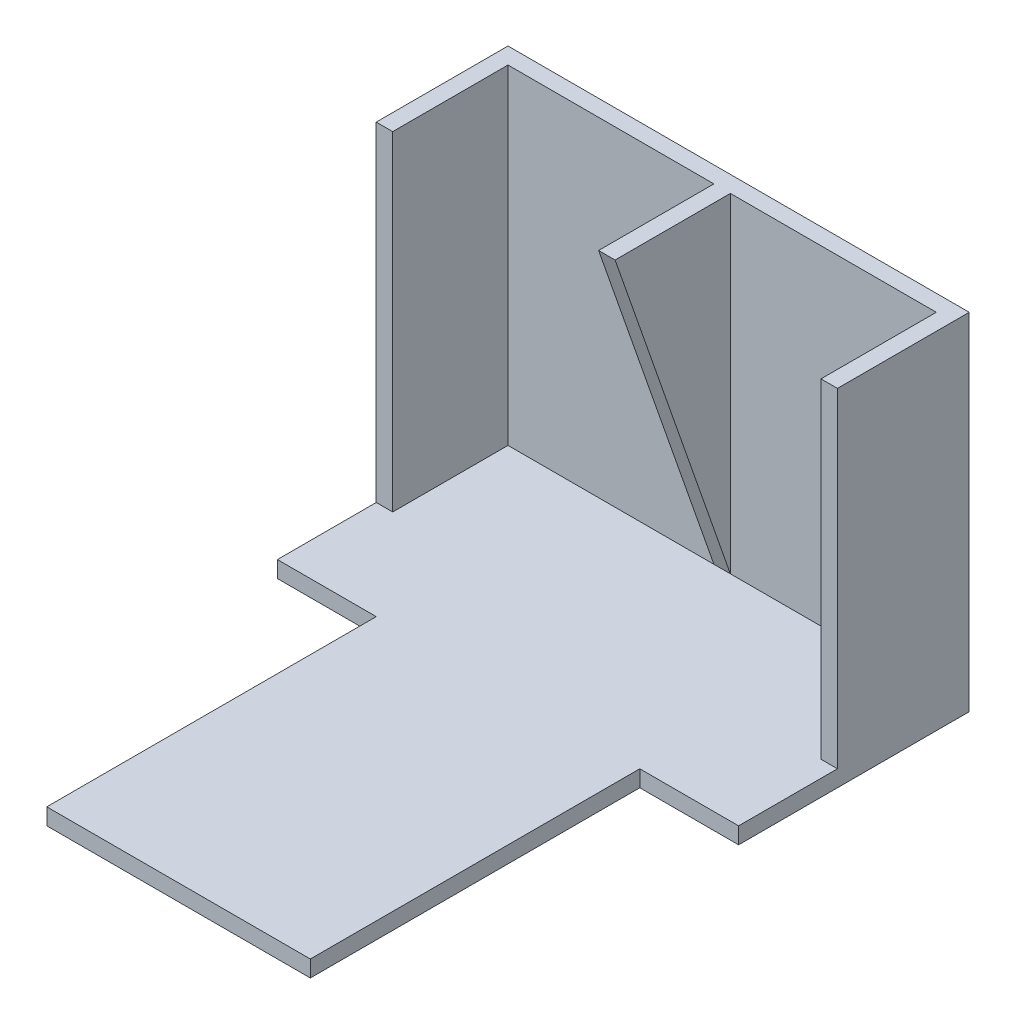
ISO-10303-21;
HEADER;
FILE_DESCRIPTION(('STEP AP214'),'2;1');
FILE_NAME('part.step','',(''),(''),'','','');
FILE_SCHEMA(('AUTOMOTIVE_DESIGN { 1 0 10303 214 1 1 1 1 }'));
ENDSEC;
DATA;
#1=APPLICATION_CONTEXT('core data for automotive mechanical design processes');
#2=APPLICATION_PROTOCOL_DEFINITION('international standard','automotive_design',2000,#1);
#3=PRODUCT_CONTEXT('',#1,'mechanical');
#4=PRODUCT('Part','Part','',(#3));
#5=PRODUCT_RELATED_PRODUCT_CATEGORY('part','',(#4));
#6=PRODUCT_DEFINITION_FORMATION('','',#4);
#7=PRODUCT_DEFINITION_CONTEXT('part definition',#1,'design');
#8=PRODUCT_DEFINITION('design','',#6,#7);
#9=PRODUCT_DEFINITION_SHAPE('','',#8);
#10=(LENGTH_UNIT() NAMED_UNIT(*) SI_UNIT(.MILLI.,.METRE.));
#11=(NAMED_UNIT(*) PLANE_ANGLE_UNIT() SI_UNIT($,.RADIAN.));
#12=(NAMED_UNIT(*) SI_UNIT($,.STERADIAN.) SOLID_ANGLE_UNIT());
#13=UNCERTAINTY_MEASURE_WITH_UNIT(LENGTH_MEASURE(1.E-05),#10,'distance_accuracy_value','');
#14=(GEOMETRIC_REPRESENTATION_CONTEXT(3) GLOBAL_UNCERTAINTY_ASSIGNED_CONTEXT((#13)) GLOBAL_UNIT_ASSIGNED_CONTEXT((#10,
#11,#12)) REPRESENTATION_CONTEXT('',''));
#15=CARTESIAN_POINT('',(0.,0.,0.));
#16=DIRECTION('',(0.,0.,1.));
#17=DIRECTION('',(1.,0.,0.));
#18=AXIS2_PLACEMENT_3D('',#15,#16,#17);
#19=CARTESIAN_POINT('',(0.,2.5,0.));
#20=DIRECTION('',(0.,-1.,0.));
#21=DIRECTION('',(0.,0.,-1.));
#22=AXIS2_PLACEMENT_3D('',#19,#20,#21);
#23=PLANE('',#22);
#24=DIRECTION('',(1.,0.,0.));
#25=VECTOR('',#24,1.);
#26=CARTESIAN_POINT('',(35.,2.5,2.5));
#27=LINE('',#26,#25);
#28=CARTESIAN_POINT('',(32.5,2.5,2.5));
#29=VERTEX_POINT('',#28);
#30=CARTESIAN_POINT('',(35.,2.5,2.5));
#31=VERTEX_POINT('',#30);
#32=EDGE_CURVE('E54',#29,#31,#27,.T.);
#33=ORIENTED_EDGE('',*,*,#32,.F.);
#34=DIRECTION('',(0.,0.,1.));
#35=VECTOR('',#34,1.);
#36=CARTESIAN_POINT('',(32.5,2.5,-15.));
#37=LINE('',#36,#35);
#38=CARTESIAN_POINT('',(32.5,2.5,-15.));
#39=VERTEX_POINT('',#38);
#40=EDGE_CURVE('E58',#39,#29,#37,.T.);
#41=ORIENTED_EDGE('',*,*,#40,.F.);
#42=DIRECTION('',(1.,0.,0.));
#43=VECTOR('',#42,1.);
#44=CARTESIAN_POINT('',(32.5,2.5,-15.));
#45=LINE('',#44,#43);
#46=CARTESIAN_POINT('',(1.24999999999998,2.5,-15.));
#47=VERTEX_POINT('',#46);
#48=EDGE_CURVE('E222',#47,#39,#45,.T.);
#49=ORIENTED_EDGE('',*,*,#48,.F.);
#50=DIRECTION('',(1.,0.,0.));
#51=VECTOR('',#50,1.);
#52=CARTESIAN_POINT('',(-35.0010000000001,2.5,-15.));
#53=LINE('',#52,#51);
#54=CARTESIAN_POINT('',(-1.25000000000001,2.5,-15.));
#55=VERTEX_POINT('',#54);
#56=EDGE_CURVE('E215',#55,#47,#53,.T.);
#57=ORIENTED_EDGE('',*,*,#56,.F.);
#58=DIRECTION('',(1.,0.,0.));
#59=VECTOR('',#58,1.);
#60=CARTESIAN_POINT('',(-1.25000000000001,2.5,-15.));
#61=LINE('',#60,#59);
#62=CARTESIAN_POINT('',(-32.5,2.5,-15.));
#63=VERTEX_POINT('',#62);
#64=EDGE_CURVE('E219',#63,#55,#61,.T.);
#65=ORIENTED_EDGE('',*,*,#64,.F.);
#66=DIRECTION('',(0.,0.,-1.));
#67=VECTOR('',#66,1.);
#68=CARTESIAN_POINT('',(-32.5,2.5,-15.));
#69=LINE('',#68,#67);
#70=CARTESIAN_POINT('',(-32.5,2.5,2.5));
#71=VERTEX_POINT('',#70);
#72=EDGE_CURVE('E214',#71,#63,#69,.T.);
#73=ORIENTED_EDGE('',*,*,#72,.F.);
#74=DIRECTION('',(1.,0.,0.));
#75=VECTOR('',#74,1.);
#76=CARTESIAN_POINT('',(-35.,2.5,2.5));
#77=LINE('',#76,#75);
#78=CARTESIAN_POINT('',(-35.,2.5,2.5));
#79=VERTEX_POINT('',#78);
#80=EDGE_CURVE('E210',#79,#71,#77,.T.);
#81=ORIENTED_EDGE('',*,*,#80,.F.);
#82=DIRECTION('',(0.,0.,1.));
#83=VECTOR('',#82,1.);
#84=CARTESIAN_POINT('',(-35.,2.5,17.5));
#85=LINE('',#84,#83);
#86=CARTESIAN_POINT('',(-35.,2.5,17.5));
#87=VERTEX_POINT('',#86);
#88=EDGE_CURVE('E263',#79,#87,#85,.T.);
#89=ORIENTED_EDGE('',*,*,#88,.T.);
#90=DIRECTION('',(1.,0.,0.));
#91=VECTOR('',#90,1.);
#92=CARTESIAN_POINT('',(-35.,2.5,17.5));
#93=LINE('',#92,#91);
#94=CARTESIAN_POINT('',(-20.,2.5,17.5));
#95=VERTEX_POINT('',#94);
#96=EDGE_CURVE('E267',#87,#95,#93,.T.);
#97=ORIENTED_EDGE('',*,*,#96,.T.);
#98=DIRECTION('',(0.,0.,1.));
#99=VECTOR('',#98,1.);
#100=CARTESIAN_POINT('',(-20.,2.5,17.5));
#101=LINE('',#100,#99);
#102=CARTESIAN_POINT('',(-20.,2.5,67.5));
#103=VERTEX_POINT('',#102);
#104=EDGE_CURVE('E270',#95,#103,#101,.T.);
#105=ORIENTED_EDGE('',*,*,#104,.T.);
#106=DIRECTION('',(1.,0.,0.));
#107=VECTOR('',#106,1.);
#108=CARTESIAN_POINT('',(20.,2.5,67.5));
#109=LINE('',#108,#107);
#110=CARTESIAN_POINT('',(20.,2.5,67.5));
#111=VERTEX_POINT('',#110);
#112=EDGE_CURVE('E273',#103,#111,#109,.T.);
#113=ORIENTED_EDGE('',*,*,#112,.T.);
#114=DIRECTION('',(0.,0.,-1.));
#115=VECTOR('',#114,1.);
#116=CARTESIAN_POINT('',(20.,2.5,17.5));
#117=LINE('',#116,#115);
#118=CARTESIAN_POINT('',(20.,2.5,17.5));
#119=VERTEX_POINT('',#118);
#120=EDGE_CURVE('E276',#111,#119,#117,.T.);
#121=ORIENTED_EDGE('',*,*,#120,.T.);
#122=DIRECTION('',(1.,0.,0.));
#123=VECTOR('',#122,1.);
#124=CARTESIAN_POINT('',(20.,2.5,17.5));
#125=LINE('',#124,#123);
#126=CARTESIAN_POINT('',(35.,2.5,17.5));
#127=VERTEX_POINT('',#126);
#128=EDGE_CURVE('E279',#119,#127,#125,.T.);
#129=ORIENTED_EDGE('',*,*,#128,.T.);
#130=DIRECTION('',(0.,0.,-1.));
#131=VECTOR('',#130,1.);
#132=CARTESIAN_POINT('',(35.,2.5,17.5));
#133=LINE('',#132,#131);
#134=EDGE_CURVE('E260',#127,#31,#133,.T.);
#135=ORIENTED_EDGE('',*,*,#134,.T.);
#136=EDGE_LOOP('',(#33,#41,#49,#57,#65,#73,#81,#89,#97,#105,#113,#121,#129,#135));
#137=FACE_BOUND('',#136,.T.);
#138=ADVANCED_FACE('F38',(#137),#23,.F.);
#139=CARTESIAN_POINT('',(35.,2.5,17.5));
#140=DIRECTION('',(-1.,0.,0.));
#141=DIRECTION('',(0.,0.,1.));
#142=AXIS2_PLACEMENT_3D('',#139,#140,#141);
#143=PLANE('',#142);
#144=DIRECTION('',(0.,0.,-1.));
#145=VECTOR('',#144,1.);
#146=CARTESIAN_POINT('',(35.,0.,17.5));
#147=LINE('',#146,#145);
#148=CARTESIAN_POINT('',(35.,0.,17.5));
#149=VERTEX_POINT('',#148);
#150=CARTESIAN_POINT('',(35.,0.,-17.5));
#151=VERTEX_POINT('',#150);
#152=EDGE_CURVE('E259',#149,#151,#147,.T.);
#153=ORIENTED_EDGE('',*,*,#152,.T.);
#154=DIRECTION('',(0.,-1.,0.));
#155=VECTOR('',#154,1.);
#156=CARTESIAN_POINT('',(35.,2.5,-17.5));
#157=LINE('',#156,#155);
#158=CARTESIAN_POINT('',(35.,52.5,-17.5));
#159=VERTEX_POINT('',#158);
#160=EDGE_CURVE('E11',#159,#151,#157,.T.);
#161=ORIENTED_EDGE('',*,*,#160,.F.);
#162=DIRECTION('',(0.,0.,-1.));
#163=VECTOR('',#162,1.);
#164=CARTESIAN_POINT('',(35.,52.5,-17.5));
#165=LINE('',#164,#163);
#166=CARTESIAN_POINT('',(35.,52.5,2.5));
#167=VERTEX_POINT('',#166);
#168=EDGE_CURVE('E201',#167,#159,#165,.T.);
#169=ORIENTED_EDGE('',*,*,#168,.F.);
#170=DIRECTION('',(0.,-1.,0.));
#171=VECTOR('',#170,1.);
#172=CARTESIAN_POINT('',(35.,52.5,2.5));
#173=LINE('',#172,#171);
#174=EDGE_CURVE('E209',#167,#31,#173,.T.);
#175=ORIENTED_EDGE('',*,*,#174,.T.);
#176=ORIENTED_EDGE('',*,*,#134,.F.);
#177=DIRECTION('',(0.,-1.,0.));
#178=VECTOR('',#177,1.);
#179=CARTESIAN_POINT('',(35.,2.5,17.5));
#180=LINE('',#179,#178);
#181=EDGE_CURVE('E282',#127,#149,#180,.T.);
#182=ORIENTED_EDGE('',*,*,#181,.T.);
#183=EDGE_LOOP('',(#153,#161,#169,#175,#176,#182));
#184=FACE_BOUND('',#183,.T.);
#185=ADVANCED_FACE('F40',(#184),#143,.F.);
#186=CARTESIAN_POINT('',(-35.,2.5,-17.5));
#187=DIRECTION('',(0.,0.,1.));
#188=DIRECTION('',(1.,0.,0.));
#189=AXIS2_PLACEMENT_3D('',#186,#187,#188);
#190=PLANE('',#189);
#191=DIRECTION('',(-1.,0.,0.));
#192=VECTOR('',#191,1.);
#193=CARTESIAN_POINT('',(-35.,0.,-17.5));
#194=LINE('',#193,#192);
#195=CARTESIAN_POINT('',(-35.,0.,-17.5));
#196=VERTEX_POINT('',#195);
#197=EDGE_CURVE('E286',#151,#196,#194,.T.);
#198=ORIENTED_EDGE('',*,*,#197,.T.);
#199=DIRECTION('',(0.,-1.,0.));
#200=VECTOR('',#199,1.);
#201=CARTESIAN_POINT('',(-35.,2.5,-17.5));
#202=LINE('',#201,#200);
#203=CARTESIAN_POINT('',(-35.,52.5,-17.5));
#204=VERTEX_POINT('',#203);
#205=EDGE_CURVE('E47',#204,#196,#202,.T.);
#206=ORIENTED_EDGE('',*,*,#205,.F.);
#207=DIRECTION('',(-1.,0.,0.));
#208=VECTOR('',#207,1.);
#209=CARTESIAN_POINT('',(35.,52.5,-17.5));
#210=LINE('',#209,#208);
#211=EDGE_CURVE('E205',#159,#204,#210,.T.);
#212=ORIENTED_EDGE('',*,*,#211,.F.);
#213=ORIENTED_EDGE('',*,*,#160,.T.);
#214=EDGE_LOOP('',(#198,#206,#212,#213));
#215=FACE_BOUND('',#214,.T.);
#216=ADVANCED_FACE('F391',(#215),#190,.F.);
#217=CARTESIAN_POINT('',(-35.,2.5,17.5));
#218=DIRECTION('',(1.,0.,0.));
#219=DIRECTION('',(0.,0.,-1.));
#220=AXIS2_PLACEMENT_3D('',#217,#218,#219);
#221=PLANE('',#220);
#222=DIRECTION('',(0.,0.,1.));
#223=VECTOR('',#222,1.);
#224=CARTESIAN_POINT('',(-35.,0.,17.5));
#225=LINE('',#224,#223);
#226=CARTESIAN_POINT('',(-35.,0.,17.5));
#227=VERTEX_POINT('',#226);
#228=EDGE_CURVE('E289',#196,#227,#225,.T.);
#229=ORIENTED_EDGE('',*,*,#228,.T.);
#230=DIRECTION('',(0.,-1.,0.));
#231=VECTOR('',#230,1.);
#232=CARTESIAN_POINT('',(-35.,2.5,17.5));
#233=LINE('',#232,#231);
#234=EDGE_CURVE('E325',#87,#227,#233,.T.);
#235=ORIENTED_EDGE('',*,*,#234,.F.);
#236=ORIENTED_EDGE('',*,*,#88,.F.);
#237=DIRECTION('',(0.,-1.,0.));
#238=VECTOR('',#237,1.);
#239=CARTESIAN_POINT('',(-35.,52.5,2.5));
#240=LINE('',#239,#238);
#241=CARTESIAN_POINT('',(-35.,52.5,2.5));
#242=VERTEX_POINT('',#241);
#243=EDGE_CURVE('E255',#242,#79,#240,.T.);
#244=ORIENTED_EDGE('',*,*,#243,.F.);
#245=DIRECTION('',(0.,0.,1.));
#246=VECTOR('',#245,1.);
#247=CARTESIAN_POINT('',(-35.,52.5,-17.5));
#248=LINE('',#247,#246);
#249=EDGE_CURVE('E229',#204,#242,#248,.T.);
#250=ORIENTED_EDGE('',*,*,#249,.F.);
#251=ORIENTED_EDGE('',*,*,#205,.T.);
#252=EDGE_LOOP('',(#229,#235,#236,#244,#250,#251));
#253=FACE_BOUND('',#252,.T.);
#254=ADVANCED_FACE('F333',(#253),#221,.F.);
#255=CARTESIAN_POINT('',(-35.,2.5,17.5));
#256=DIRECTION('',(0.,0.,-1.));
#257=DIRECTION('',(-1.,0.,0.));
#258=AXIS2_PLACEMENT_3D('',#255,#256,#257);
#259=PLANE('',#258);
#260=DIRECTION('',(1.,0.,0.));
#261=VECTOR('',#260,1.);
#262=CARTESIAN_POINT('',(-35.,0.,17.5));
#263=LINE('',#262,#261);
#264=CARTESIAN_POINT('',(-20.,0.,17.5));
#265=VERTEX_POINT('',#264);
#266=EDGE_CURVE('E292',#227,#265,#263,.T.);
#267=ORIENTED_EDGE('',*,*,#266,.T.);
#268=DIRECTION('',(0.,-1.,0.));
#269=VECTOR('',#268,1.);
#270=CARTESIAN_POINT('',(-20.,2.5,17.5));
#271=LINE('',#270,#269);
#272=EDGE_CURVE('E321',#95,#265,#271,.T.);
#273=ORIENTED_EDGE('',*,*,#272,.F.);
#274=ORIENTED_EDGE('',*,*,#96,.F.);
#275=ORIENTED_EDGE('',*,*,#234,.T.);
#276=EDGE_LOOP('',(#267,#273,#274,#275));
#277=FACE_BOUND('',#276,.T.);
#278=ADVANCED_FACE('F346',(#277),#259,.F.);
#279=CARTESIAN_POINT('',(-20.,2.5,17.5));
#280=DIRECTION('',(1.,0.,0.));
#281=DIRECTION('',(0.,0.,-1.));
#282=AXIS2_PLACEMENT_3D('',#279,#280,#281);
#283=PLANE('',#282);
#284=DIRECTION('',(0.,0.,1.));
#285=VECTOR('',#284,1.);
#286=CARTESIAN_POINT('',(-20.,0.,17.5));
#287=LINE('',#286,#285);
#288=CARTESIAN_POINT('',(-20.,0.,67.5));
#289=VERTEX_POINT('',#288);
#290=EDGE_CURVE('E295',#265,#289,#287,.T.);
#291=ORIENTED_EDGE('',*,*,#290,.T.);
#292=DIRECTION('',(0.,-1.,0.));
#293=VECTOR('',#292,1.);
#294=CARTESIAN_POINT('',(-20.,2.5,67.5));
#295=LINE('',#294,#293);
#296=EDGE_CURVE('E317',#103,#289,#295,.T.);
#297=ORIENTED_EDGE('',*,*,#296,.F.);
#298=ORIENTED_EDGE('',*,*,#104,.F.);
#299=ORIENTED_EDGE('',*,*,#272,.T.);
#300=EDGE_LOOP('',(#291,#297,#298,#299));
#301=FACE_BOUND('',#300,.T.);
#302=ADVANCED_FACE('F350',(#301),#283,.F.);
#303=CARTESIAN_POINT('',(20.,2.5,67.5));
#304=DIRECTION('',(0.,0.,-1.));
#305=DIRECTION('',(-1.,0.,0.));
#306=AXIS2_PLACEMENT_3D('',#303,#304,#305);
#307=PLANE('',#306);
#308=DIRECTION('',(1.,0.,0.));
#309=VECTOR('',#308,1.);
#310=CARTESIAN_POINT('',(20.,0.,67.5));
#311=LINE('',#310,#309);
#312=CARTESIAN_POINT('',(20.,0.,67.5));
#313=VERTEX_POINT('',#312);
#314=EDGE_CURVE('E298',#289,#313,#311,.T.);
#315=ORIENTED_EDGE('',*,*,#314,.T.);
#316=DIRECTION('',(0.,-1.,0.));
#317=VECTOR('',#316,1.);
#318=CARTESIAN_POINT('',(20.,2.5,67.5));
#319=LINE('',#318,#317);
#320=EDGE_CURVE('E313',#111,#313,#319,.T.);
#321=ORIENTED_EDGE('',*,*,#320,.F.);
#322=ORIENTED_EDGE('',*,*,#112,.F.);
#323=ORIENTED_EDGE('',*,*,#296,.T.);
#324=EDGE_LOOP('',(#315,#321,#322,#323));
#325=FACE_BOUND('',#324,.T.);
#326=ADVANCED_FACE('F404',(#325),#307,.F.);
#327=CARTESIAN_POINT('',(20.,2.5,17.5));
#328=DIRECTION('',(-1.,0.,0.));
#329=DIRECTION('',(0.,0.,1.));
#330=AXIS2_PLACEMENT_3D('',#327,#328,#329);
#331=PLANE('',#330);
#332=DIRECTION('',(0.,0.,-1.));
#333=VECTOR('',#332,1.);
#334=CARTESIAN_POINT('',(20.,0.,17.5));
#335=LINE('',#334,#333);
#336=CARTESIAN_POINT('',(20.,0.,17.5));
#337=VERTEX_POINT('',#336);
#338=EDGE_CURVE('E301',#313,#337,#335,.T.);
#339=ORIENTED_EDGE('',*,*,#338,.T.);
#340=DIRECTION('',(0.,-1.,0.));
#341=VECTOR('',#340,1.);
#342=CARTESIAN_POINT('',(20.,2.5,17.5));
#343=LINE('',#342,#341);
#344=EDGE_CURVE('E309',#119,#337,#343,.T.);
#345=ORIENTED_EDGE('',*,*,#344,.F.);
#346=ORIENTED_EDGE('',*,*,#120,.F.);
#347=ORIENTED_EDGE('',*,*,#320,.T.);
#348=EDGE_LOOP('',(#339,#345,#346,#347));
#349=FACE_BOUND('',#348,.T.);
#350=ADVANCED_FACE('F402',(#349),#331,.F.);
#351=CARTESIAN_POINT('',(20.,2.5,17.5));
#352=DIRECTION('',(0.,0.,-1.));
#353=DIRECTION('',(-1.,0.,0.));
#354=AXIS2_PLACEMENT_3D('',#351,#352,#353);
#355=PLANE('',#354);
#356=DIRECTION('',(1.,0.,0.));
#357=VECTOR('',#356,1.);
#358=CARTESIAN_POINT('',(20.,0.,17.5));
#359=LINE('',#358,#357);
#360=EDGE_CURVE('E264',#337,#149,#359,.T.);
#361=ORIENTED_EDGE('',*,*,#360,.T.);
#362=ORIENTED_EDGE('',*,*,#181,.F.);
#363=ORIENTED_EDGE('',*,*,#128,.F.);
#364=ORIENTED_EDGE('',*,*,#344,.T.);
#365=EDGE_LOOP('',(#361,#362,#363,#364));
#366=FACE_BOUND('',#365,.T.);
#367=ADVANCED_FACE('F397',(#366),#355,.F.);
#368=CARTESIAN_POINT('',(0.,0.,0.));
#369=DIRECTION('',(0.,-1.,0.));
#370=DIRECTION('',(0.,0.,-1.));
#371=AXIS2_PLACEMENT_3D('',#368,#369,#370);
#372=PLANE('',#371);
#373=ORIENTED_EDGE('',*,*,#152,.F.);
#374=ORIENTED_EDGE('',*,*,#360,.F.);
#375=ORIENTED_EDGE('',*,*,#338,.F.);
#376=ORIENTED_EDGE('',*,*,#314,.F.);
#377=ORIENTED_EDGE('',*,*,#290,.F.);
#378=ORIENTED_EDGE('',*,*,#266,.F.);
#379=ORIENTED_EDGE('',*,*,#228,.F.);
#380=ORIENTED_EDGE('',*,*,#197,.F.);
#381=EDGE_LOOP('',(#373,#374,#375,#376,#377,#378,#379,#380));
#382=FACE_BOUND('',#381,.T.);
#383=ADVANCED_FACE('F341',(#382),#372,.T.);
#384=CARTESIAN_POINT('',(-35.,52.5,2.5));
#385=DIRECTION('',(0.,0.,-1.));
#386=DIRECTION('',(-1.,0.,0.));
#387=AXIS2_PLACEMENT_3D('',#384,#385,#386);
#388=PLANE('',#387);
#389=ORIENTED_EDGE('',*,*,#80,.T.);
#390=DIRECTION('',(0.,-1.,0.));
#391=VECTOR('',#390,1.);
#392=CARTESIAN_POINT('',(-32.5,52.5,2.5));
#393=LINE('',#392,#391);
#394=CARTESIAN_POINT('',(-32.5,52.5,2.5));
#395=VERTEX_POINT('',#394);
#396=EDGE_CURVE('E251',#395,#71,#393,.T.);
#397=ORIENTED_EDGE('',*,*,#396,.F.);
#398=DIRECTION('',(1.,0.,0.));
#399=VECTOR('',#398,1.);
#400=CARTESIAN_POINT('',(-35.,52.5,2.5));
#401=LINE('',#400,#399);
#402=EDGE_CURVE('E358',#242,#395,#401,.T.);
#403=ORIENTED_EDGE('',*,*,#402,.F.);
#404=ORIENTED_EDGE('',*,*,#243,.T.);
#405=EDGE_LOOP('',(#389,#397,#403,#404));
#406=FACE_BOUND('',#405,.T.);
#407=ADVANCED_FACE('F356',(#406),#388,.F.);
#408=CARTESIAN_POINT('',(-32.5,52.5,-15.));
#409=DIRECTION('',(-1.,0.,0.));
#410=DIRECTION('',(0.,0.,1.));
#411=AXIS2_PLACEMENT_3D('',#408,#409,#410);
#412=PLANE('',#411);
#413=ORIENTED_EDGE('',*,*,#72,.T.);
#414=DIRECTION('',(0.,-1.,0.));
#415=VECTOR('',#414,1.);
#416=CARTESIAN_POINT('',(-32.5,52.5,-15.));
#417=LINE('',#416,#415);
#418=CARTESIAN_POINT('',(-32.5,52.5,-15.));
#419=VERTEX_POINT('',#418);
#420=EDGE_CURVE('E247',#419,#63,#417,.T.);
#421=ORIENTED_EDGE('',*,*,#420,.F.);
#422=DIRECTION('',(0.,0.,-1.));
#423=VECTOR('',#422,1.);
#424=CARTESIAN_POINT('',(-32.5,52.5,-15.));
#425=LINE('',#424,#423);
#426=EDGE_CURVE('E186',#395,#419,#425,.T.);
#427=ORIENTED_EDGE('',*,*,#426,.F.);
#428=ORIENTED_EDGE('',*,*,#396,.T.);
#429=EDGE_LOOP('',(#413,#421,#427,#428));
#430=FACE_BOUND('',#429,.T.);
#431=ADVANCED_FACE('F369',(#430),#412,.F.);
#432=CARTESIAN_POINT('',(-1.25000000000001,52.5,-15.));
#433=DIRECTION('',(0.,0.,-1.));
#434=DIRECTION('',(-1.,0.,0.));
#435=AXIS2_PLACEMENT_3D('',#432,#433,#434);
#436=PLANE('',#435);
#437=ORIENTED_EDGE('',*,*,#64,.T.);
#438=DIRECTION('',(0.,-1.,0.));
#439=VECTOR('',#438,1.);
#440=CARTESIAN_POINT('',(-1.25000000000001,52.5,-15.));
#441=LINE('',#440,#439);
#442=CARTESIAN_POINT('',(-1.25000000000001,52.5,-15.));
#443=VERTEX_POINT('',#442);
#444=EDGE_CURVE('E176',#443,#55,#441,.T.);
#445=ORIENTED_EDGE('',*,*,#444,.F.);
#446=DIRECTION('',(1.,0.,0.));
#447=VECTOR('',#446,1.);
#448=CARTESIAN_POINT('',(-1.25000000000001,52.5,-15.));
#449=LINE('',#448,#447);
#450=EDGE_CURVE('E182',#419,#443,#449,.T.);
#451=ORIENTED_EDGE('',*,*,#450,.F.);
#452=ORIENTED_EDGE('',*,*,#420,.T.);
#453=EDGE_LOOP('',(#437,#445,#451,#452));
#454=FACE_BOUND('',#453,.T.);
#455=ADVANCED_FACE('F371',(#454),#436,.F.);
#456=CARTESIAN_POINT('',(-1.25000000000001,52.5,2.5));
#457=DIRECTION('',(1.,0.,0.));
#458=DIRECTION('',(0.,0.,-1.));
#459=AXIS2_PLACEMENT_3D('',#456,#457,#458);
#460=PLANE('',#459);
#461=ORIENTED_EDGE('',*,*,#444,.T.);
#462=DIRECTION('',(0.,-0.943858356366017,-0.330350424728106));
#463=VECTOR('',#462,1.);
#464=CARTESIAN_POINT('',(-1.25000000000001,2.50000000000001,-15.));
#465=LINE('',#464,#463);
#466=CARTESIAN_POINT('',(-1.25000000000001,52.5,2.5));
#467=VERTEX_POINT('',#466);
#468=EDGE_CURVE('E160',#467,#55,#465,.T.);
#469=ORIENTED_EDGE('',*,*,#468,.F.);
#470=DIRECTION('',(0.,0.,1.));
#471=VECTOR('',#470,1.);
#472=CARTESIAN_POINT('',(-1.25000000000001,52.5,2.5));
#473=LINE('',#472,#471);
#474=EDGE_CURVE('E169',#443,#467,#473,.T.);
#475=ORIENTED_EDGE('',*,*,#474,.F.);
#476=EDGE_LOOP('',(#461,#469,#475));
#477=FACE_BOUND('',#476,.T.);
#478=ADVANCED_FACE('F174',(#477),#460,.F.);
#479=CARTESIAN_POINT('',(1.24999999999999,52.5,2.5));
#480=DIRECTION('',(-1.,0.,0.));
#481=DIRECTION('',(0.,0.,1.));
#482=AXIS2_PLACEMENT_3D('',#479,#480,#481);
#483=PLANE('',#482);
#484=DIRECTION('',(0.,0.,-1.));
#485=VECTOR('',#484,1.);
#486=CARTESIAN_POINT('',(1.24999999999999,52.5,2.5));
#487=LINE('',#486,#485);
#488=CARTESIAN_POINT('',(1.24999999999999,52.5,2.5));
#489=VERTEX_POINT('',#488);
#490=CARTESIAN_POINT('',(1.24999999999998,52.5,-15.));
#491=VERTEX_POINT('',#490);
#492=EDGE_CURVE('E168',#489,#491,#487,.T.);
#493=ORIENTED_EDGE('',*,*,#492,.F.);
#494=DIRECTION('',(0.,0.943858356366017,0.330350424728106));
#495=VECTOR('',#494,1.);
#496=CARTESIAN_POINT('',(1.24999999999998,2.5,-15.));
#497=LINE('',#496,#495);
#498=EDGE_CURVE('E163',#47,#489,#497,.T.);
#499=ORIENTED_EDGE('',*,*,#498,.F.);
#500=DIRECTION('',(0.,-1.,0.));
#501=VECTOR('',#500,1.);
#502=CARTESIAN_POINT('',(1.24999999999998,52.5,-15.));
#503=LINE('',#502,#501);
#504=EDGE_CURVE('E241',#491,#47,#503,.T.);
#505=ORIENTED_EDGE('',*,*,#504,.F.);
#506=EDGE_LOOP('',(#493,#499,#505));
#507=FACE_BOUND('',#506,.T.);
#508=ADVANCED_FACE('F376',(#507),#483,.F.);
#509=CARTESIAN_POINT('',(32.5,52.5,-15.));
#510=DIRECTION('',(0.,0.,-1.));
#511=DIRECTION('',(-1.,0.,0.));
#512=AXIS2_PLACEMENT_3D('',#509,#510,#511);
#513=PLANE('',#512);
#514=ORIENTED_EDGE('',*,*,#48,.T.);
#515=DIRECTION('',(0.,-1.,0.));
#516=VECTOR('',#515,1.);
#517=CARTESIAN_POINT('',(32.5,52.5,-15.));
#518=LINE('',#517,#516);
#519=CARTESIAN_POINT('',(32.5,52.5,-15.));
#520=VERTEX_POINT('',#519);
#521=EDGE_CURVE('E237',#520,#39,#518,.T.);
#522=ORIENTED_EDGE('',*,*,#521,.F.);
#523=DIRECTION('',(1.,0.,0.));
#524=VECTOR('',#523,1.);
#525=CARTESIAN_POINT('',(32.5,52.5,-15.));
#526=LINE('',#525,#524);
#527=EDGE_CURVE('E192',#491,#520,#526,.T.);
#528=ORIENTED_EDGE('',*,*,#527,.F.);
#529=ORIENTED_EDGE('',*,*,#504,.T.);
#530=EDGE_LOOP('',(#514,#522,#528,#529));
#531=FACE_BOUND('',#530,.T.);
#532=ADVANCED_FACE('F382',(#531),#513,.F.);
#533=CARTESIAN_POINT('',(32.5,52.5,-15.));
#534=DIRECTION('',(1.,0.,0.));
#535=DIRECTION('',(0.,0.,-1.));
#536=AXIS2_PLACEMENT_3D('',#533,#534,#535);
#537=PLANE('',#536);
#538=ORIENTED_EDGE('',*,*,#40,.T.);
#539=DIRECTION('',(0.,-1.,0.));
#540=VECTOR('',#539,1.);
#541=CARTESIAN_POINT('',(32.5,52.5,2.5));
#542=LINE('',#541,#540);
#543=CARTESIAN_POINT('',(32.5,52.5,2.5));
#544=VERTEX_POINT('',#543);
#545=EDGE_CURVE('E233',#544,#29,#542,.T.);
#546=ORIENTED_EDGE('',*,*,#545,.F.);
#547=DIRECTION('',(0.,0.,1.));
#548=VECTOR('',#547,1.);
#549=CARTESIAN_POINT('',(32.5,52.5,-15.));
#550=LINE('',#549,#548);
#551=EDGE_CURVE('E195',#520,#544,#550,.T.);
#552=ORIENTED_EDGE('',*,*,#551,.F.);
#553=ORIENTED_EDGE('',*,*,#521,.T.);
#554=EDGE_LOOP('',(#538,#546,#552,#553));
#555=FACE_BOUND('',#554,.T.);
#556=ADVANCED_FACE('F384',(#555),#537,.F.);
#557=CARTESIAN_POINT('',(35.,52.5,2.5));
#558=DIRECTION('',(0.,0.,-1.));
#559=DIRECTION('',(-1.,0.,0.));
#560=AXIS2_PLACEMENT_3D('',#557,#558,#559);
#561=PLANE('',#560);
#562=ORIENTED_EDGE('',*,*,#32,.T.);
#563=ORIENTED_EDGE('',*,*,#174,.F.);
#564=DIRECTION('',(1.,0.,0.));
#565=VECTOR('',#564,1.);
#566=CARTESIAN_POINT('',(35.,52.5,2.5));
#567=LINE('',#566,#565);
#568=EDGE_CURVE('E198',#544,#167,#567,.T.);
#569=ORIENTED_EDGE('',*,*,#568,.F.);
#570=ORIENTED_EDGE('',*,*,#545,.T.);
#571=EDGE_LOOP('',(#562,#563,#569,#570));
#572=FACE_BOUND('',#571,.T.);
#573=ADVANCED_FACE('F388',(#572),#561,.F.);
#574=CARTESIAN_POINT('',(0.,52.5,0.));
#575=DIRECTION('',(0.,1.,0.));
#576=DIRECTION('',(0.,0.,1.));
#577=AXIS2_PLACEMENT_3D('',#574,#575,#576);
#578=PLANE('',#577);
#579=ORIENTED_EDGE('',*,*,#249,.T.);
#580=ORIENTED_EDGE('',*,*,#402,.T.);
#581=ORIENTED_EDGE('',*,*,#426,.T.);
#582=ORIENTED_EDGE('',*,*,#450,.T.);
#583=ORIENTED_EDGE('',*,*,#474,.T.);
#584=DIRECTION('',(1.,0.,0.));
#585=VECTOR('',#584,1.);
#586=CARTESIAN_POINT('',(-1.25000000000001,52.5,2.5));
#587=LINE('',#586,#585);
#588=EDGE_CURVE('E157',#467,#489,#587,.T.);
#589=ORIENTED_EDGE('',*,*,#588,.T.);
#590=ORIENTED_EDGE('',*,*,#492,.T.);
#591=ORIENTED_EDGE('',*,*,#527,.T.);
#592=ORIENTED_EDGE('',*,*,#551,.T.);
#593=ORIENTED_EDGE('',*,*,#568,.T.);
#594=ORIENTED_EDGE('',*,*,#168,.T.);
#595=ORIENTED_EDGE('',*,*,#211,.T.);
#596=EDGE_LOOP('',(#579,#580,#581,#582,#583,#589,#590,#591,#592,#593,#594,#595));
#597=FACE_BOUND('',#596,.T.);
#598=ADVANCED_FACE('F180',(#597),#578,.T.);
#599=CARTESIAN_POINT('',(-35.0010000000001,2.5,-15.));
#600=DIRECTION('',(0.,0.330350424728106,-0.943858356366017));
#601=DIRECTION('',(0.,0.943858356366017,0.330350424728106));
#602=AXIS2_PLACEMENT_3D('',#599,#600,#601);
#603=PLANE('',#602);
#604=ORIENTED_EDGE('',*,*,#468,.T.);
#605=ORIENTED_EDGE('',*,*,#56,.T.);
#606=ORIENTED_EDGE('',*,*,#498,.T.);
#607=ORIENTED_EDGE('',*,*,#588,.F.);
#608=EDGE_LOOP('',(#604,#605,#606,#607));
#609=FACE_BOUND('',#608,.T.);
#610=ADVANCED_FACE('F159',(#609),#603,.F.);
#611=CLOSED_SHELL('',(#138,#185,#216,#254,#278,#302,#326,#350,#367,#383,#407,#431,#455,#478,
#508,#532,#556,#573,#598,#610));
#612=MANIFOLD_SOLID_BREP('B2',#611);
#613=ADVANCED_BREP_SHAPE_REPRESENTATION('',(#18,#612),#14);
#614=SHAPE_DEFINITION_REPRESENTATION(#9,#613);
ENDSEC;
END-ISO-10303-21;
